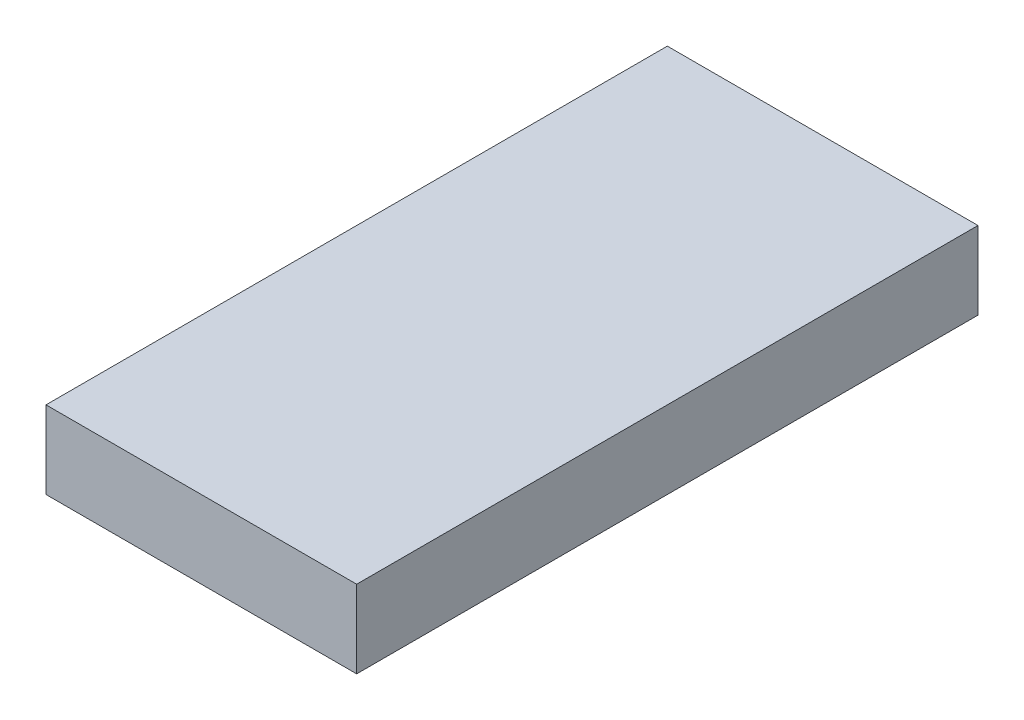
ISO-10303-21;
HEADER;
FILE_DESCRIPTION(('STEP AP214'),'2;1');
FILE_NAME('part.step','',(''),(''),'','','');
FILE_SCHEMA(('AUTOMOTIVE_DESIGN { 1 0 10303 214 1 1 1 1 }'));
ENDSEC;
DATA;
#1=APPLICATION_CONTEXT('core data for automotive mechanical design processes');
#2=APPLICATION_PROTOCOL_DEFINITION('international standard','automotive_design',2000,#1);
#3=PRODUCT_CONTEXT('',#1,'mechanical');
#4=PRODUCT('Part','Part','',(#3));
#5=PRODUCT_RELATED_PRODUCT_CATEGORY('part','',(#4));
#6=PRODUCT_DEFINITION_FORMATION('','',#4);
#7=PRODUCT_DEFINITION_CONTEXT('part definition',#1,'design');
#8=PRODUCT_DEFINITION('design','',#6,#7);
#9=PRODUCT_DEFINITION_SHAPE('','',#8);
#10=(LENGTH_UNIT() NAMED_UNIT(*) SI_UNIT(.MILLI.,.METRE.));
#11=(NAMED_UNIT(*) PLANE_ANGLE_UNIT() SI_UNIT($,.RADIAN.));
#12=(NAMED_UNIT(*) SI_UNIT($,.STERADIAN.) SOLID_ANGLE_UNIT());
#13=UNCERTAINTY_MEASURE_WITH_UNIT(LENGTH_MEASURE(1.E-05),#10,'distance_accuracy_value','');
#14=(GEOMETRIC_REPRESENTATION_CONTEXT(3) GLOBAL_UNCERTAINTY_ASSIGNED_CONTEXT((#13)) GLOBAL_UNIT_ASSIGNED_CONTEXT((#10,
#11,#12)) REPRESENTATION_CONTEXT('',''));
#15=CARTESIAN_POINT('',(0.,0.,0.));
#16=DIRECTION('',(0.,0.,1.));
#17=DIRECTION('',(1.,0.,0.));
#18=AXIS2_PLACEMENT_3D('',#15,#16,#17);
#19=CARTESIAN_POINT('',(10.,5.,20.));
#20=DIRECTION('',(-1.,0.,0.));
#21=DIRECTION('',(0.,0.,1.));
#22=AXIS2_PLACEMENT_3D('',#19,#20,#21);
#23=PLANE('',#22);
#24=DIRECTION('',(0.,0.,-1.));
#25=VECTOR('',#24,1.);
#26=CARTESIAN_POINT('',(10.,0.,20.));
#27=LINE('',#26,#25);
#28=CARTESIAN_POINT('',(10.,0.,20.));
#29=VERTEX_POINT('',#28);
#30=CARTESIAN_POINT('',(10.,0.,-20.));
#31=VERTEX_POINT('',#30);
#32=EDGE_CURVE('E99',#29,#31,#27,.T.);
#33=ORIENTED_EDGE('',*,*,#32,.T.);
#34=DIRECTION('',(0.,-1.,0.));
#35=VECTOR('',#34,1.);
#36=CARTESIAN_POINT('',(10.,5.,-20.));
#37=LINE('',#36,#35);
#38=CARTESIAN_POINT('',(10.,5.,-20.));
#39=VERTEX_POINT('',#38);
#40=EDGE_CURVE('E11',#39,#31,#37,.T.);
#41=ORIENTED_EDGE('',*,*,#40,.F.);
#42=DIRECTION('',(0.,0.,-1.));
#43=VECTOR('',#42,1.);
#44=CARTESIAN_POINT('',(10.,5.,20.));
#45=LINE('',#44,#43);
#46=CARTESIAN_POINT('',(10.,5.,20.));
#47=VERTEX_POINT('',#46);
#48=EDGE_CURVE('E87',#47,#39,#45,.T.);
#49=ORIENTED_EDGE('',*,*,#48,.F.);
#50=DIRECTION('',(0.,-1.,0.));
#51=VECTOR('',#50,1.);
#52=CARTESIAN_POINT('',(10.,5.,20.));
#53=LINE('',#52,#51);
#54=EDGE_CURVE('E95',#47,#29,#53,.T.);
#55=ORIENTED_EDGE('',*,*,#54,.T.);
#56=EDGE_LOOP('',(#33,#41,#49,#55));
#57=FACE_BOUND('',#56,.T.);
#58=ADVANCED_FACE('F36',(#57),#23,.F.);
#59=CARTESIAN_POINT('',(-10.,5.,-20.));
#60=DIRECTION('',(0.,0.,1.));
#61=DIRECTION('',(1.,0.,0.));
#62=AXIS2_PLACEMENT_3D('',#59,#60,#61);
#63=PLANE('',#62);
#64=DIRECTION('',(-1.,0.,0.));
#65=VECTOR('',#64,1.);
#66=CARTESIAN_POINT('',(-10.,0.,-20.));
#67=LINE('',#66,#65);
#68=CARTESIAN_POINT('',(-10.,0.,-20.));
#69=VERTEX_POINT('',#68);
#70=EDGE_CURVE('E91',#31,#69,#67,.T.);
#71=ORIENTED_EDGE('',*,*,#70,.T.);
#72=DIRECTION('',(0.,-1.,0.));
#73=VECTOR('',#72,1.);
#74=CARTESIAN_POINT('',(-10.,5.,-20.));
#75=LINE('',#74,#73);
#76=CARTESIAN_POINT('',(-10.,5.,-20.));
#77=VERTEX_POINT('',#76);
#78=EDGE_CURVE('E44',#77,#69,#75,.T.);
#79=ORIENTED_EDGE('',*,*,#78,.F.);
#80=DIRECTION('',(-1.,0.,0.));
#81=VECTOR('',#80,1.);
#82=CARTESIAN_POINT('',(-10.,5.,-20.));
#83=LINE('',#82,#81);
#84=EDGE_CURVE('E82',#39,#77,#83,.T.);
#85=ORIENTED_EDGE('',*,*,#84,.F.);
#86=ORIENTED_EDGE('',*,*,#40,.T.);
#87=EDGE_LOOP('',(#71,#79,#85,#86));
#88=FACE_BOUND('',#87,.T.);
#89=ADVANCED_FACE('F90',(#88),#63,.F.);
#90=CARTESIAN_POINT('',(-10.,5.,20.));
#91=DIRECTION('',(1.,0.,0.));
#92=DIRECTION('',(0.,0.,-1.));
#93=AXIS2_PLACEMENT_3D('',#90,#91,#92);
#94=PLANE('',#93);
#95=DIRECTION('',(0.,0.,1.));
#96=VECTOR('',#95,1.);
#97=CARTESIAN_POINT('',(-10.,0.,20.));
#98=LINE('',#97,#96);
#99=CARTESIAN_POINT('',(-10.,0.,20.));
#100=VERTEX_POINT('',#99);
#101=EDGE_CURVE('E69',#69,#100,#98,.T.);
#102=ORIENTED_EDGE('',*,*,#101,.T.);
#103=DIRECTION('',(0.,-1.,0.));
#104=VECTOR('',#103,1.);
#105=CARTESIAN_POINT('',(-10.,5.,20.));
#106=LINE('',#105,#104);
#107=CARTESIAN_POINT('',(-10.,5.,20.));
#108=VERTEX_POINT('',#107);
#109=EDGE_CURVE('E92',#108,#100,#106,.T.);
#110=ORIENTED_EDGE('',*,*,#109,.F.);
#111=DIRECTION('',(0.,0.,1.));
#112=VECTOR('',#111,1.);
#113=CARTESIAN_POINT('',(-10.,5.,20.));
#114=LINE('',#113,#112);
#115=EDGE_CURVE('E85',#77,#108,#114,.T.);
#116=ORIENTED_EDGE('',*,*,#115,.F.);
#117=ORIENTED_EDGE('',*,*,#78,.T.);
#118=EDGE_LOOP('',(#102,#110,#116,#117));
#119=FACE_BOUND('',#118,.T.);
#120=ADVANCED_FACE('F93',(#119),#94,.F.);
#121=CARTESIAN_POINT('',(-10.,5.,20.));
#122=DIRECTION('',(0.,0.,-1.));
#123=DIRECTION('',(-1.,0.,0.));
#124=AXIS2_PLACEMENT_3D('',#121,#122,#123);
#125=PLANE('',#124);
#126=DIRECTION('',(1.,0.,0.));
#127=VECTOR('',#126,1.);
#128=CARTESIAN_POINT('',(-10.,0.,20.));
#129=LINE('',#128,#127);
#130=EDGE_CURVE('E75',#100,#29,#129,.T.);
#131=ORIENTED_EDGE('',*,*,#130,.T.);
#132=ORIENTED_EDGE('',*,*,#54,.F.);
#133=DIRECTION('',(1.,0.,0.));
#134=VECTOR('',#133,1.);
#135=CARTESIAN_POINT('',(-10.,5.,20.));
#136=LINE('',#135,#134);
#137=EDGE_CURVE('E52',#108,#47,#136,.T.);
#138=ORIENTED_EDGE('',*,*,#137,.F.);
#139=ORIENTED_EDGE('',*,*,#109,.T.);
#140=EDGE_LOOP('',(#131,#132,#138,#139));
#141=FACE_BOUND('',#140,.T.);
#142=ADVANCED_FACE('F106',(#141),#125,.F.);
#143=CARTESIAN_POINT('',(0.,5.,0.));
#144=DIRECTION('',(0.,-1.,0.));
#145=DIRECTION('',(0.,0.,-1.));
#146=AXIS2_PLACEMENT_3D('',#143,#144,#145);
#147=PLANE('',#146);
#148=ORIENTED_EDGE('',*,*,#48,.T.);
#149=ORIENTED_EDGE('',*,*,#84,.T.);
#150=ORIENTED_EDGE('',*,*,#115,.T.);
#151=ORIENTED_EDGE('',*,*,#137,.T.);
#152=EDGE_LOOP('',(#148,#149,#150,#151));
#153=FACE_BOUND('',#152,.T.);
#154=ADVANCED_FACE('F83',(#153),#147,.F.);
#155=CARTESIAN_POINT('',(0.,0.,0.));
#156=DIRECTION('',(0.,-1.,0.));
#157=DIRECTION('',(0.,0.,-1.));
#158=AXIS2_PLACEMENT_3D('',#155,#156,#157);
#159=PLANE('',#158);
#160=ORIENTED_EDGE('',*,*,#32,.F.);
#161=ORIENTED_EDGE('',*,*,#130,.F.);
#162=ORIENTED_EDGE('',*,*,#101,.F.);
#163=ORIENTED_EDGE('',*,*,#70,.F.);
#164=EDGE_LOOP('',(#160,#161,#162,#163));
#165=FACE_BOUND('',#164,.T.);
#166=ADVANCED_FACE('F109',(#165),#159,.T.);
#167=CLOSED_SHELL('',(#58,#89,#120,#142,#154,#166));
#168=MANIFOLD_SOLID_BREP('B2',#167);
#169=ADVANCED_BREP_SHAPE_REPRESENTATION('',(#18,#168),#14);
#170=SHAPE_DEFINITION_REPRESENTATION(#9,#169);
ENDSEC;
END-ISO-10303-21;
